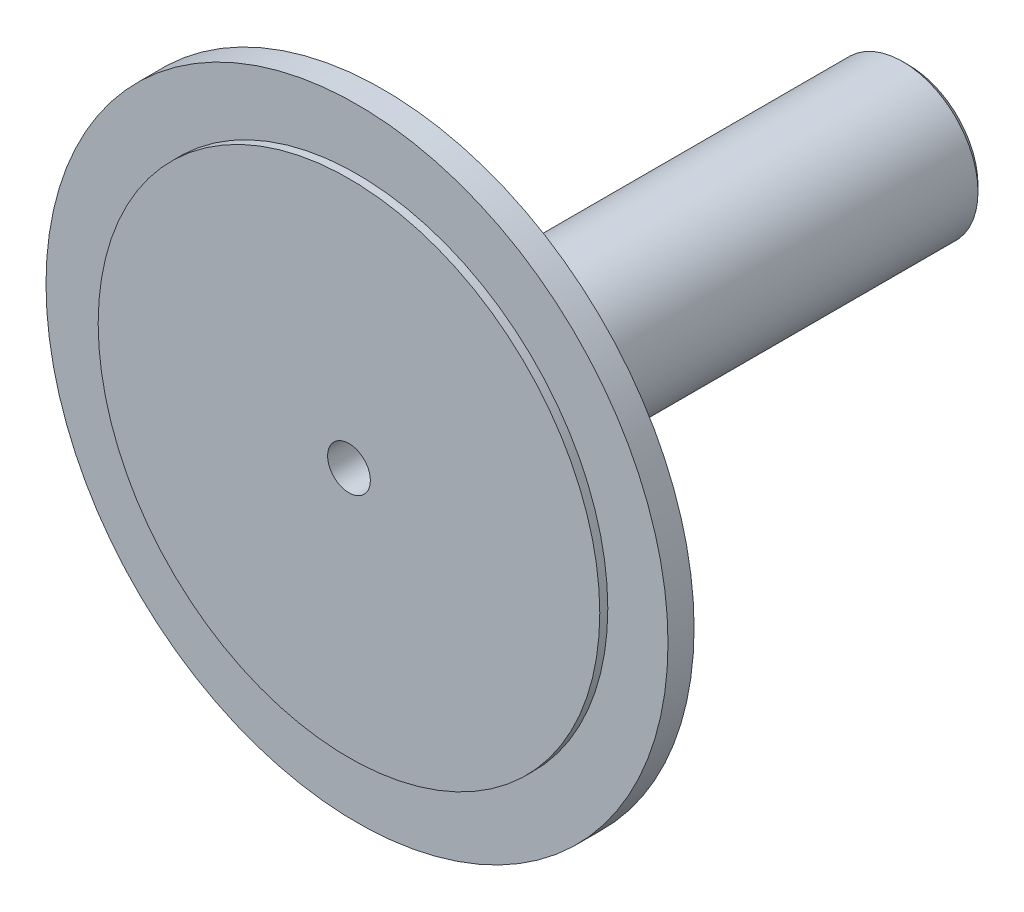
ISO-10303-21;
HEADER;
FILE_DESCRIPTION(('STEP AP214'),'2;1');
FILE_NAME('part.step','',(''),(''),'','','');
FILE_SCHEMA(('AUTOMOTIVE_DESIGN { 1 0 10303 214 1 1 1 1 }'));
ENDSEC;
DATA;
#1=APPLICATION_CONTEXT('core data for automotive mechanical design processes');
#2=APPLICATION_PROTOCOL_DEFINITION('international standard','automotive_design',2000,#1);
#3=PRODUCT_CONTEXT('',#1,'mechanical');
#4=PRODUCT('Part','Part','',(#3));
#5=PRODUCT_RELATED_PRODUCT_CATEGORY('part','',(#4));
#6=PRODUCT_DEFINITION_FORMATION('','',#4);
#7=PRODUCT_DEFINITION_CONTEXT('part definition',#1,'design');
#8=PRODUCT_DEFINITION('design','',#6,#7);
#9=PRODUCT_DEFINITION_SHAPE('','',#8);
#10=(LENGTH_UNIT() NAMED_UNIT(*) SI_UNIT(.MILLI.,.METRE.));
#11=(NAMED_UNIT(*) PLANE_ANGLE_UNIT() SI_UNIT($,.RADIAN.));
#12=(NAMED_UNIT(*) SI_UNIT($,.STERADIAN.) SOLID_ANGLE_UNIT());
#13=UNCERTAINTY_MEASURE_WITH_UNIT(LENGTH_MEASURE(1.E-05),#10,'distance_accuracy_value','');
#14=(GEOMETRIC_REPRESENTATION_CONTEXT(3) GLOBAL_UNCERTAINTY_ASSIGNED_CONTEXT((#13)) GLOBAL_UNIT_ASSIGNED_CONTEXT((#10,
#11,#12)) REPRESENTATION_CONTEXT('',''));
#15=CARTESIAN_POINT('',(0.,0.,0.));
#16=DIRECTION('',(0.,0.,1.));
#17=DIRECTION('',(1.,0.,0.));
#18=AXIS2_PLACEMENT_3D('',#15,#16,#17);
#19=CARTESIAN_POINT('',(0.,0.,6.35));
#20=DIRECTION('',(0.,0.,-1.));
#21=DIRECTION('',(-1.,0.,0.));
#22=AXIS2_PLACEMENT_3D('',#19,#20,#21);
#23=CYLINDRICAL_SURFACE('',#22,39.37);
#24=CARTESIAN_POINT('',(0.,0.,3.04800000000001));
#25=DIRECTION('',(0.,0.,1.));
#26=DIRECTION('',(1.,0.,0.));
#27=AXIS2_PLACEMENT_3D('',#24,#25,#26);
#28=CIRCLE('',#27,39.37);
#29=CARTESIAN_POINT('',(39.37,0.,3.04800000000001));
#30=VERTEX_POINT('',#29);
#31=EDGE_CURVE('E42',#30,#30,#28,.T.);
#32=ORIENTED_EDGE('',*,*,#31,.T.);
#33=EDGE_LOOP('',(#32));
#34=FACE_BOUND('',#33,.T.);
#35=CARTESIAN_POINT('',(0.,0.,6.35));
#36=DIRECTION('',(0.,0.,1.));
#37=DIRECTION('',(1.,0.,0.));
#38=AXIS2_PLACEMENT_3D('',#35,#36,#37);
#39=CIRCLE('',#38,39.37);
#40=CARTESIAN_POINT('',(39.37,0.,6.35));
#41=VERTEX_POINT('',#40);
#42=EDGE_CURVE('E61',#41,#41,#39,.T.);
#43=ORIENTED_EDGE('',*,*,#42,.F.);
#44=EDGE_LOOP('',(#43));
#45=FACE_BOUND('',#44,.T.);
#46=ADVANCED_FACE('F35',(#34,#45),#23,.T.);
#47=CARTESIAN_POINT('',(0.,0.,6.35));
#48=DIRECTION('',(0.,0.,1.));
#49=DIRECTION('',(1.,0.,0.));
#50=AXIS2_PLACEMENT_3D('',#47,#48,#49);
#51=PLANE('',#50);
#52=CARTESIAN_POINT('',(0.,0.,6.35));
#53=DIRECTION('',(0.,0.,1.));
#54=DIRECTION('',(1.,0.,0.));
#55=AXIS2_PLACEMENT_3D('',#52,#53,#54);
#56=CIRCLE('',#55,31.75);
#57=CARTESIAN_POINT('',(31.75,0.,6.35));
#58=VERTEX_POINT('',#57);
#59=EDGE_CURVE('E65',#58,#58,#56,.T.);
#60=ORIENTED_EDGE('',*,*,#59,.F.);
#61=EDGE_LOOP('',(#60));
#62=FACE_BOUND('',#61,.T.);
#63=ORIENTED_EDGE('',*,*,#42,.T.);
#64=EDGE_LOOP('',(#63));
#65=FACE_BOUND('',#64,.T.);
#66=ADVANCED_FACE('F100',(#62,#65),#51,.T.);
#67=CARTESIAN_POINT('',(0.,0.,0.));
#68=DIRECTION('',(0.,0.,1.));
#69=DIRECTION('',(1.,0.,0.));
#70=AXIS2_PLACEMENT_3D('',#67,#68,#69);
#71=PLANE('',#70);
#72=CARTESIAN_POINT('',(0.,0.,0.));
#73=DIRECTION('',(0.,0.,1.));
#74=DIRECTION('',(1.,0.,0.));
#75=AXIS2_PLACEMENT_3D('',#72,#73,#74);
#76=CIRCLE('',#75,34.0907091385301);
#77=CARTESIAN_POINT('',(34.0907091385301,0.,0.));
#78=VERTEX_POINT('',#77);
#79=EDGE_CURVE('E10',#78,#78,#76,.F.);
#80=ORIENTED_EDGE('',*,*,#79,.T.);
#81=EDGE_LOOP('',(#80));
#82=FACE_BOUND('',#81,.T.);
#83=CARTESIAN_POINT('',(0.,0.,0.));
#84=DIRECTION('',(0.,0.,1.));
#85=DIRECTION('',(1.,0.,0.));
#86=AXIS2_PLACEMENT_3D('',#83,#84,#85);
#87=CIRCLE('',#86,10.287);
#88=CARTESIAN_POINT('',(10.287,0.,0.));
#89=VERTEX_POINT('',#88);
#90=EDGE_CURVE('E46',#89,#89,#87,.T.);
#91=ORIENTED_EDGE('',*,*,#90,.T.);
#92=EDGE_LOOP('',(#91));
#93=FACE_BOUND('',#92,.T.);
#94=ADVANCED_FACE('F96',(#82,#93),#71,.F.);
#95=CARTESIAN_POINT('',(0.,0.,7.366));
#96=DIRECTION('',(0.,0.,-1.));
#97=DIRECTION('',(-1.,0.,0.));
#98=AXIS2_PLACEMENT_3D('',#95,#96,#97);
#99=CYLINDRICAL_SURFACE('',#98,31.75);
#100=CARTESIAN_POINT('',(0.,0.,7.366));
#101=DIRECTION('',(0.,0.,1.));
#102=DIRECTION('',(1.,0.,0.));
#103=AXIS2_PLACEMENT_3D('',#100,#101,#102);
#104=CIRCLE('',#103,31.75);
#105=CARTESIAN_POINT('',(31.75,0.,7.366));
#106=VERTEX_POINT('',#105);
#107=EDGE_CURVE('E64',#106,#106,#104,.T.);
#108=ORIENTED_EDGE('',*,*,#107,.F.);
#109=EDGE_LOOP('',(#108));
#110=FACE_BOUND('',#109,.T.);
#111=ORIENTED_EDGE('',*,*,#59,.T.);
#112=EDGE_LOOP('',(#111));
#113=FACE_BOUND('',#112,.T.);
#114=ADVANCED_FACE('F90',(#110,#113),#99,.T.);
#115=CARTESIAN_POINT('',(0.,0.,7.366));
#116=DIRECTION('',(0.,0.,1.));
#117=DIRECTION('',(1.,0.,0.));
#118=AXIS2_PLACEMENT_3D('',#115,#116,#117);
#119=PLANE('',#118);
#120=CARTESIAN_POINT('',(0.,0.,7.366));
#121=DIRECTION('',(0.,0.,1.));
#122=DIRECTION('',(1.,0.,0.));
#123=AXIS2_PLACEMENT_3D('',#120,#121,#122);
#124=CIRCLE('',#123,2.7051);
#125=CARTESIAN_POINT('',(2.7051,0.,7.366));
#126=VERTEX_POINT('',#125);
#127=EDGE_CURVE('E68',#126,#126,#124,.T.);
#128=ORIENTED_EDGE('',*,*,#127,.F.);
#129=EDGE_LOOP('',(#128));
#130=FACE_BOUND('',#129,.T.);
#131=ORIENTED_EDGE('',*,*,#107,.T.);
#132=EDGE_LOOP('',(#131));
#133=FACE_BOUND('',#132,.T.);
#134=ADVANCED_FACE('F86',(#130,#133),#119,.T.);
#135=CARTESIAN_POINT('',(0.,0.,-63.5));
#136=DIRECTION('',(0.,0.,1.));
#137=DIRECTION('',(1.,0.,0.));
#138=AXIS2_PLACEMENT_3D('',#135,#136,#137);
#139=CYLINDRICAL_SURFACE('',#138,9.525);
#140=CARTESIAN_POINT('',(0.,0.,-62.738));
#141=DIRECTION('',(0.,0.,-1.));
#142=DIRECTION('',(-1.,0.,0.));
#143=AXIS2_PLACEMENT_3D('',#140,#141,#142);
#144=CIRCLE('',#143,9.525);
#145=CARTESIAN_POINT('',(9.525,0.,-62.738));
#146=VERTEX_POINT('',#145);
#147=EDGE_CURVE('E50',#146,#146,#144,.F.);
#148=CARTESIAN_POINT('',(0.,0.,-0.762000000000013));
#149=DIRECTION('',(0.,0.,1.));
#150=DIRECTION('',(1.,0.,0.));
#151=AXIS2_PLACEMENT_3D('',#148,#149,#150);
#152=CIRCLE('',#151,9.525);
#153=CARTESIAN_POINT('',(9.525,0.,-0.762000000000013));
#154=VERTEX_POINT('',#153);
#155=EDGE_CURVE('E55',#154,#154,#152,.F.);
#156=CARTESIAN_POINT('',(9.525,0.,-62.738));
#157=CARTESIAN_POINT('',(9.525,0.,-62.0924166666667));
#158=CARTESIAN_POINT('',(9.525,0.,-61.4468333333333));
#159=CARTESIAN_POINT('',(9.525,0.,-60.1556666666666));
#160=CARTESIAN_POINT('',(9.525,0.,-59.5100833333333));
#161=CARTESIAN_POINT('',(9.525,0.,-58.2189166666667));
#162=CARTESIAN_POINT('',(9.525,0.,-57.5733333333333));
#163=CARTESIAN_POINT('',(9.525,0.,-56.2821666666667));
#164=CARTESIAN_POINT('',(9.525,0.,-55.6365833333333));
#165=CARTESIAN_POINT('',(9.525,0.,-54.3454166666667));
#166=CARTESIAN_POINT('',(9.525,0.,-53.6998333333333));
#167=CARTESIAN_POINT('',(9.525,0.,-52.4086666666667));
#168=CARTESIAN_POINT('',(9.525,0.,-51.7630833333333));
#169=CARTESIAN_POINT('',(9.525,0.,-50.4719166666667));
#170=CARTESIAN_POINT('',(9.525,0.,-49.8263333333333));
#171=CARTESIAN_POINT('',(9.525,0.,-48.5351666666667));
#172=CARTESIAN_POINT('',(9.525,0.,-47.8895833333333));
#173=CARTESIAN_POINT('',(9.525,0.,-46.5984166666667));
#174=CARTESIAN_POINT('',(9.525,0.,-45.9528333333333));
#175=CARTESIAN_POINT('',(9.525,0.,-44.6616666666667));
#176=CARTESIAN_POINT('',(9.525,0.,-44.0160833333333));
#177=CARTESIAN_POINT('',(9.525,0.,-42.7249166666667));
#178=CARTESIAN_POINT('',(9.525,0.,-42.0793333333333));
#179=CARTESIAN_POINT('',(9.525,0.,-40.7881666666667));
#180=CARTESIAN_POINT('',(9.525,0.,-40.1425833333333));
#181=CARTESIAN_POINT('',(9.525,0.,-38.8514166666667));
#182=CARTESIAN_POINT('',(9.525,0.,-38.2058333333333));
#183=CARTESIAN_POINT('',(9.525,0.,-36.9146666666667));
#184=CARTESIAN_POINT('',(9.525,0.,-36.2690833333333));
#185=CARTESIAN_POINT('',(9.525,0.,-34.9779166666667));
#186=CARTESIAN_POINT('',(9.525,0.,-34.3323333333333));
#187=CARTESIAN_POINT('',(9.525,0.,-33.0411666666667));
#188=CARTESIAN_POINT('',(9.525,0.,-32.3955833333333));
#189=CARTESIAN_POINT('',(9.525,0.,-31.1044166666667));
#190=CARTESIAN_POINT('',(9.525,0.,-30.4588333333333));
#191=CARTESIAN_POINT('',(9.525,0.,-29.1676666666667));
#192=CARTESIAN_POINT('',(9.525,0.,-28.5220833333333));
#193=CARTESIAN_POINT('',(9.525,0.,-27.2309166666667));
#194=CARTESIAN_POINT('',(9.525,0.,-26.5853333333333));
#195=CARTESIAN_POINT('',(9.525,0.,-25.2941666666667));
#196=CARTESIAN_POINT('',(9.525,0.,-24.6485833333333));
#197=CARTESIAN_POINT('',(9.525,0.,-23.3574166666667));
#198=CARTESIAN_POINT('',(9.525,0.,-22.7118333333333));
#199=CARTESIAN_POINT('',(9.525,0.,-21.4206666666667));
#200=CARTESIAN_POINT('',(9.525,0.,-20.7750833333333));
#201=CARTESIAN_POINT('',(9.525,0.,-19.4839166666667));
#202=CARTESIAN_POINT('',(9.525,0.,-18.8383333333333));
#203=CARTESIAN_POINT('',(9.525,0.,-17.5471666666667));
#204=CARTESIAN_POINT('',(9.525,0.,-16.9015833333333));
#205=CARTESIAN_POINT('',(9.525,0.,-15.6104166666667));
#206=CARTESIAN_POINT('',(9.525,0.,-14.9648333333333));
#207=CARTESIAN_POINT('',(9.525,0.,-13.6736666666667));
#208=CARTESIAN_POINT('',(9.525,0.,-13.0280833333333));
#209=CARTESIAN_POINT('',(9.525,0.,-11.7369166666667));
#210=CARTESIAN_POINT('',(9.525,0.,-11.0913333333333));
#211=CARTESIAN_POINT('',(9.525,0.,-9.80016666666668));
#212=CARTESIAN_POINT('',(9.525,0.,-9.15458333333334));
#213=CARTESIAN_POINT('',(9.525,0.,-7.86341666666668));
#214=CARTESIAN_POINT('',(9.525,0.,-7.21783333333334));
#215=CARTESIAN_POINT('',(9.525,0.,-5.92666666666668));
#216=CARTESIAN_POINT('',(9.525,0.,-5.28108333333334));
#217=CARTESIAN_POINT('',(9.525,0.,-3.98991666666668));
#218=CARTESIAN_POINT('',(9.525,0.,-3.34433333333335));
#219=CARTESIAN_POINT('',(9.525,0.,-2.05316666666668));
#220=CARTESIAN_POINT('',(9.525,0.,-1.40758333333335));
#221=CARTESIAN_POINT('',(9.525,0.,-0.762000000000013));
#222=B_SPLINE_CURVE_WITH_KNOTS('',3,(#156,#157,#158,#159,#160,#161,#162,#163,#164,#165,#166,
#167,#168,#169,#170,#171,#172,#173,#174,#175,#176,#177,#178,#179,#180,#181,#182,#183,#184,#185,
#186,#187,#188,#189,#190,#191,#192,#193,#194,#195,#196,#197,#198,#199,#200,#201,#202,#203,#204,
#205,#206,#207,#208,#209,#210,#211,#212,#213,#214,#215,#216,#217,#218,#219,#220,#221),
.UNSPECIFIED.,.F.,.F.,(4,2,2,2,2,2,2,2,2,2,2,2,2,2,2,2,2,2,2,2,2,2,2,2,2,2,2,2,2,2,2,2,4),(0.,
1.93675000000001,3.8735,5.81025,7.747,9.68375000000001,11.6205,13.55725,15.494,17.43075,19.3675,
21.30425,23.241,25.17775,27.1145,29.05125,30.988,32.92475,34.8615,36.79825,38.735,40.67175,
42.6085,44.54525,46.482,48.41875,50.3555,52.29225,54.229,56.16575,58.1025,60.03925,61.976),.UNSPECIFIED.);
#223=EDGE_CURVE('BSEAM89',#146,#154,#222,.T.);
#224=ORIENTED_EDGE('',*,*,#147,.T.);
#225=ORIENTED_EDGE('',*,*,#155,.T.);
#226=ORIENTED_EDGE('',*,*,#223,.T.);
#227=ORIENTED_EDGE('',*,*,#223,.F.);
#228=EDGE_LOOP('',(#224,#226,#225,#227));
#229=FACE_BOUND('',#228,.T.);
#230=ADVANCED_FACE('F89',(#229),#139,.T.);
#231=CARTESIAN_POINT('',(0.,0.,-63.5));
#232=DIRECTION('',(0.,0.,-1.));
#233=DIRECTION('',(-1.,0.,0.));
#234=AXIS2_PLACEMENT_3D('',#231,#232,#233);
#235=PLANE('',#234);
#236=CARTESIAN_POINT('',(0.,0.,-63.5));
#237=DIRECTION('',(0.,0.,-1.));
#238=DIRECTION('',(-1.,0.,0.));
#239=AXIS2_PLACEMENT_3D('',#236,#237,#238);
#240=CIRCLE('',#239,8.763);
#241=CARTESIAN_POINT('',(8.76300000000001,0.,-63.5));
#242=VERTEX_POINT('',#241);
#243=EDGE_CURVE('E58',#242,#242,#240,.T.);
#244=ORIENTED_EDGE('',*,*,#243,.T.);
#245=EDGE_LOOP('',(#244));
#246=FACE_BOUND('',#245,.T.);
#247=ADVANCED_FACE('F114',(#246),#235,.T.);
#248=CARTESIAN_POINT('',(0.,0.,-63.5));
#249=DIRECTION('',(0.,0.,1.));
#250=DIRECTION('',(1.,0.,0.));
#251=AXIS2_PLACEMENT_3D('',#248,#249,#250);
#252=CONICAL_SURFACE('',#251,8.763,0.785398163397439);
#253=CARTESIAN_POINT('',(9.52500000000001,0.,-62.738));
#254=CARTESIAN_POINT('',(9.51706250000001,0.,-62.7459375));
#255=CARTESIAN_POINT('',(9.50912500000001,0.,-62.753875));
#256=CARTESIAN_POINT('',(9.49325000000001,0.,-62.76975));
#257=CARTESIAN_POINT('',(9.48531250000001,0.,-62.7776875));
#258=CARTESIAN_POINT('',(9.46943750000001,0.,-62.7935625));
#259=CARTESIAN_POINT('',(9.46150000000001,0.,-62.8015));
#260=CARTESIAN_POINT('',(9.44562500000001,0.,-62.817375));
#261=CARTESIAN_POINT('',(9.43768750000001,0.,-62.8253125));
#262=CARTESIAN_POINT('',(9.42181250000001,0.,-62.8411875));
#263=CARTESIAN_POINT('',(9.41387500000001,0.,-62.849125));
#264=CARTESIAN_POINT('',(9.39800000000001,0.,-62.865));
#265=CARTESIAN_POINT('',(9.39006250000001,0.,-62.8729375));
#266=CARTESIAN_POINT('',(9.37418750000001,0.,-62.8888125));
#267=CARTESIAN_POINT('',(9.36625000000001,0.,-62.89675));
#268=CARTESIAN_POINT('',(9.35037500000001,0.,-62.912625));
#269=CARTESIAN_POINT('',(9.34243750000001,0.,-62.9205625));
#270=CARTESIAN_POINT('',(9.32656250000001,0.,-62.9364375));
#271=CARTESIAN_POINT('',(9.31862500000001,0.,-62.944375));
#272=CARTESIAN_POINT('',(9.30275000000001,0.,-62.96025));
#273=CARTESIAN_POINT('',(9.29481250000001,0.,-62.9681875));
#274=CARTESIAN_POINT('',(9.27893750000001,0.,-62.9840625));
#275=CARTESIAN_POINT('',(9.27100000000001,0.,-62.992));
#276=CARTESIAN_POINT('',(9.25512500000001,0.,-63.007875));
#277=CARTESIAN_POINT('',(9.24718750000001,0.,-63.0158125));
#278=CARTESIAN_POINT('',(9.23131250000001,0.,-63.0316875));
#279=CARTESIAN_POINT('',(9.22337500000001,0.,-63.039625));
#280=CARTESIAN_POINT('',(9.20750000000001,0.,-63.0555));
#281=CARTESIAN_POINT('',(9.19956250000001,0.,-63.0634375));
#282=CARTESIAN_POINT('',(9.18368750000001,0.,-63.0793125));
#283=CARTESIAN_POINT('',(9.17575000000001,0.,-63.08725));
#284=CARTESIAN_POINT('',(9.15987500000001,0.,-63.103125));
#285=CARTESIAN_POINT('',(9.15193750000001,0.,-63.1110625));
#286=CARTESIAN_POINT('',(9.13606250000001,0.,-63.1269375));
#287=CARTESIAN_POINT('',(9.12812500000001,0.,-63.134875));
#288=CARTESIAN_POINT('',(9.11225000000001,0.,-63.15075));
#289=CARTESIAN_POINT('',(9.10431250000001,0.,-63.1586875));
#290=CARTESIAN_POINT('',(9.08843750000001,0.,-63.1745625));
#291=CARTESIAN_POINT('',(9.08050000000001,0.,-63.1825));
#292=CARTESIAN_POINT('',(9.06462500000001,0.,-63.198375));
#293=CARTESIAN_POINT('',(9.05668750000001,0.,-63.2063125));
#294=CARTESIAN_POINT('',(9.04081250000001,0.,-63.2221875));
#295=CARTESIAN_POINT('',(9.03287500000001,0.,-63.230125));
#296=CARTESIAN_POINT('',(9.01700000000001,0.,-63.246));
#297=CARTESIAN_POINT('',(9.00906250000001,0.,-63.2539375));
#298=CARTESIAN_POINT('',(8.99318750000001,0.,-63.2698125));
#299=CARTESIAN_POINT('',(8.98525000000001,0.,-63.27775));
#300=CARTESIAN_POINT('',(8.96937500000001,0.,-63.293625));
#301=CARTESIAN_POINT('',(8.96143750000001,0.,-63.3015625));
#302=CARTESIAN_POINT('',(8.94556250000001,0.,-63.3174375));
#303=CARTESIAN_POINT('',(8.93762500000001,0.,-63.325375));
#304=CARTESIAN_POINT('',(8.92175000000001,0.,-63.34125));
#305=CARTESIAN_POINT('',(8.91381250000001,0.,-63.3491875));
#306=CARTESIAN_POINT('',(8.89793750000001,0.,-63.3650625));
#307=CARTESIAN_POINT('',(8.89000000000001,0.,-63.373));
#308=CARTESIAN_POINT('',(8.87412500000001,0.,-63.388875));
#309=CARTESIAN_POINT('',(8.86618750000001,0.,-63.3968125));
#310=CARTESIAN_POINT('',(8.85031250000001,0.,-63.4126875));
#311=CARTESIAN_POINT('',(8.84237500000001,0.,-63.420625));
#312=CARTESIAN_POINT('',(8.82650000000001,0.,-63.4365));
#313=CARTESIAN_POINT('',(8.81856250000001,0.,-63.4444375));
#314=CARTESIAN_POINT('',(8.80268750000001,0.,-63.4603125));
#315=CARTESIAN_POINT('',(8.79475000000001,0.,-63.46825));
#316=CARTESIAN_POINT('',(8.77887500000001,0.,-63.484125));
#317=CARTESIAN_POINT('',(8.77093750000001,0.,-63.4920625));
#318=CARTESIAN_POINT('',(8.76300000000001,0.,-63.5));
#319=B_SPLINE_CURVE_WITH_KNOTS('',3,(#253,#254,#255,#256,#257,#258,#259,#260,#261,#262,#263,
#264,#265,#266,#267,#268,#269,#270,#271,#272,#273,#274,#275,#276,#277,#278,#279,#280,#281,#282,
#283,#284,#285,#286,#287,#288,#289,#290,#291,#292,#293,#294,#295,#296,#297,#298,#299,#300,#301,
#302,#303,#304,#305,#306,#307,#308,#309,#310,#311,#312,#313,#314,#315,#316,#317,#318),
.UNSPECIFIED.,.F.,.F.,(4,2,2,2,2,2,2,2,2,2,2,2,2,2,2,2,2,2,2,2,2,2,2,2,2,2,2,2,2,2,2,2,4),(0.,
0.0336759604540172,0.0673519209080247,0.101027881362033,0.134703841816041,0.168379802270048,
0.202055762724065,0.235731723178074,0.269407683632082,0.303083644086089,0.336759604540096,
0.370435564994115,0.404111525448122,0.43778748590213,0.471463446356137,0.505139406810146,
0.538815367264153,0.57249132771817,0.606167288172178,0.639843248626187,0.673519209080194,
0.707195169534201,0.740871129988219,0.774547090442227,0.808223050896235,0.841899011350242,
0.875574971804251,0.909250932258268,0.942926892712275,0.976602853166283,1.01027881362029,
1.0439547740743,1.07763073452832),.UNSPECIFIED.);
#320=EDGE_CURVE('BSEAM112',#146,#242,#319,.T.);
#321=ORIENTED_EDGE('',*,*,#147,.F.);
#322=ORIENTED_EDGE('',*,*,#243,.F.);
#323=ORIENTED_EDGE('',*,*,#320,.T.);
#324=ORIENTED_EDGE('',*,*,#320,.F.);
#325=EDGE_LOOP('',(#321,#323,#322,#324));
#326=FACE_BOUND('',#325,.T.);
#327=ADVANCED_FACE('F112',(#326),#252,.T.);
#328=CARTESIAN_POINT('',(0.,0.,-0.762000000000013));
#329=DIRECTION('',(0.,0.,1.));
#330=DIRECTION('',(1.,0.,0.));
#331=AXIS2_PLACEMENT_3D('',#328,#329,#330);
#332=CONICAL_SURFACE('',#331,9.525,0.78539816339744);
#333=CARTESIAN_POINT('',(10.287,0.,0.));
#334=CARTESIAN_POINT('',(10.2790625,0.,-0.00793750000000067));
#335=CARTESIAN_POINT('',(10.271125,0.,-0.0158750000000007));
#336=CARTESIAN_POINT('',(10.25525,0.,-0.0317500000000006));
#337=CARTESIAN_POINT('',(10.2473125,0.,-0.0396875000000006));
#338=CARTESIAN_POINT('',(10.2314375,0.,-0.0555625000000009));
#339=CARTESIAN_POINT('',(10.2235,0.,-0.0635000000000011));
#340=CARTESIAN_POINT('',(10.207625,0.,-0.0793750000000015));
#341=CARTESIAN_POINT('',(10.1996875,0.,-0.0873125000000015));
#342=CARTESIAN_POINT('',(10.1838125,0.,-0.103187500000002));
#343=CARTESIAN_POINT('',(10.175875,0.,-0.111125000000002));
#344=CARTESIAN_POINT('',(10.16,0.,-0.127000000000002));
#345=CARTESIAN_POINT('',(10.1520625,0.,-0.134937500000002));
#346=CARTESIAN_POINT('',(10.1361875,0.,-0.150812500000002));
#347=CARTESIAN_POINT('',(10.12825,0.,-0.158750000000003));
#348=CARTESIAN_POINT('',(10.112375,0.,-0.174625000000003));
#349=CARTESIAN_POINT('',(10.1044375,0.,-0.182562500000003));
#350=CARTESIAN_POINT('',(10.0885625,0.,-0.198437500000003));
#351=CARTESIAN_POINT('',(10.080625,0.,-0.206375000000003));
#352=CARTESIAN_POINT('',(10.06475,0.,-0.222250000000004));
#353=CARTESIAN_POINT('',(10.0568125,0.,-0.230187500000004));
#354=CARTESIAN_POINT('',(10.0409375,0.,-0.246062500000004));
#355=CARTESIAN_POINT('',(10.033,0.,-0.254000000000004));
#356=CARTESIAN_POINT('',(10.017125,0.,-0.269875000000005));
#357=CARTESIAN_POINT('',(10.0091875,0.,-0.277812500000005));
#358=CARTESIAN_POINT('',(9.9933125,0.,-0.293687500000005));
#359=CARTESIAN_POINT('',(9.985375,0.,-0.301625000000005));
#360=CARTESIAN_POINT('',(9.9695,0.,-0.317500000000005));
#361=CARTESIAN_POINT('',(9.9615625,0.,-0.325437500000005));
#362=CARTESIAN_POINT('',(9.9456875,0.,-0.341312500000006));
#363=CARTESIAN_POINT('',(9.93775,0.,-0.349250000000006));
#364=CARTESIAN_POINT('',(9.921875,0.,-0.365125000000006));
#365=CARTESIAN_POINT('',(9.9139375,0.,-0.373062500000006));
#366=CARTESIAN_POINT('',(9.8980625,0.,-0.388937500000006));
#367=CARTESIAN_POINT('',(9.890125,0.,-0.396875000000007));
#368=CARTESIAN_POINT('',(9.87425,0.,-0.412750000000007));
#369=CARTESIAN_POINT('',(9.8663125,0.,-0.420687500000007));
#370=CARTESIAN_POINT('',(9.8504375,0.,-0.436562500000007));
#371=CARTESIAN_POINT('',(9.8425,0.,-0.444500000000008));
#372=CARTESIAN_POINT('',(9.826625,0.,-0.460375000000008));
#373=CARTESIAN_POINT('',(9.8186875,0.,-0.468312500000008));
#374=CARTESIAN_POINT('',(9.8028125,0.,-0.484187500000008));
#375=CARTESIAN_POINT('',(9.794875,0.,-0.492125000000008));
#376=CARTESIAN_POINT('',(9.779,0.,-0.508000000000009));
#377=CARTESIAN_POINT('',(9.7710625,0.,-0.515937500000009));
#378=CARTESIAN_POINT('',(9.7551875,0.,-0.531812500000009));
#379=CARTESIAN_POINT('',(9.74725,0.,-0.539750000000009));
#380=CARTESIAN_POINT('',(9.731375,0.,-0.555625000000009));
#381=CARTESIAN_POINT('',(9.7234375,0.,-0.56356250000001));
#382=CARTESIAN_POINT('',(9.7075625,0.,-0.57943750000001));
#383=CARTESIAN_POINT('',(9.699625,0.,-0.58737500000001));
#384=CARTESIAN_POINT('',(9.68375,0.,-0.60325000000001));
#385=CARTESIAN_POINT('',(9.6758125,0.,-0.61118750000001));
#386=CARTESIAN_POINT('',(9.6599375,0.,-0.627062500000011));
#387=CARTESIAN_POINT('',(9.652,0.,-0.635000000000011));
#388=CARTESIAN_POINT('',(9.636125,0.,-0.650875000000011));
#389=CARTESIAN_POINT('',(9.6281875,0.,-0.658812500000011));
#390=CARTESIAN_POINT('',(9.6123125,0.,-0.674687500000011));
#391=CARTESIAN_POINT('',(9.604375,0.,-0.682625000000011));
#392=CARTESIAN_POINT('',(9.5885,0.,-0.698500000000012));
#393=CARTESIAN_POINT('',(9.5805625,0.,-0.706437500000012));
#394=CARTESIAN_POINT('',(9.5646875,0.,-0.722312500000012));
#395=CARTESIAN_POINT('',(9.55675,0.,-0.730250000000012));
#396=CARTESIAN_POINT('',(9.540875,0.,-0.746125000000012));
#397=CARTESIAN_POINT('',(9.5329375,0.,-0.754062500000012));
#398=CARTESIAN_POINT('',(9.525,0.,-0.762000000000013));
#399=B_SPLINE_CURVE_WITH_KNOTS('',3,(#333,#334,#335,#336,#337,#338,#339,#340,#341,#342,#343,
#344,#345,#346,#347,#348,#349,#350,#351,#352,#353,#354,#355,#356,#357,#358,#359,#360,#361,#362,
#363,#364,#365,#366,#367,#368,#369,#370,#371,#372,#373,#374,#375,#376,#377,#378,#379,#380,#381,
#382,#383,#384,#385,#386,#387,#388,#389,#390,#391,#392,#393,#394,#395,#396,#397,#398),
.UNSPECIFIED.,.F.,.F.,(4,2,2,2,2,2,2,2,2,2,2,2,2,2,2,2,2,2,2,2,2,2,2,2,2,2,2,2,2,2,2,2,4),(0.,
0.0336759604540093,0.0673519209080198,0.101027881362029,0.134703841816038,0.168379802270048,
0.202055762724058,0.235731723178067,0.269407683632077,0.303083644086087,0.336759604540096,
0.370435564994106,0.404111525448115,0.437787485902125,0.471463446356135,0.505139406810144,
0.538815367264155,0.572491327718164,0.606167288172173,0.639843248626182,0.673519209080193,
0.707195169534202,0.740871129988211,0.774547090442222,0.808223050896231,0.84189901135024,
0.87557497180425,0.90925093225826,0.942926892712269,0.976602853166278,1.01027881362029,
1.0439547740743,1.07763073452831),.UNSPECIFIED.);
#400=EDGE_CURVE('BSEAM82',#89,#154,#399,.T.);
#401=ORIENTED_EDGE('',*,*,#90,.F.);
#402=ORIENTED_EDGE('',*,*,#155,.F.);
#403=ORIENTED_EDGE('',*,*,#400,.T.);
#404=ORIENTED_EDGE('',*,*,#400,.F.);
#405=EDGE_LOOP('',(#401,#403,#402,#404));
#406=FACE_BOUND('',#405,.T.);
#407=ADVANCED_FACE('F82',(#406),#332,.T.);
#408=CARTESIAN_POINT('',(0.,0.,7.366));
#409=DIRECTION('',(0.,0.,1.));
#410=DIRECTION('',(1.,0.,0.));
#411=AXIS2_PLACEMENT_3D('',#408,#409,#410);
#412=CYLINDRICAL_SURFACE('',#411,2.7051);
#413=CARTESIAN_POINT('',(0.,0.,-11.684));
#414=DIRECTION('',(0.,0.,1.));
#415=DIRECTION('',(1.,0.,0.));
#416=AXIS2_PLACEMENT_3D('',#413,#414,#415);
#417=CIRCLE('',#416,2.7051);
#418=CARTESIAN_POINT('',(2.7051,0.,-11.684));
#419=VERTEX_POINT('',#418);
#420=EDGE_CURVE('E73',#419,#419,#417,.T.);
#421=ORIENTED_EDGE('',*,*,#420,.F.);
#422=EDGE_LOOP('',(#421));
#423=FACE_BOUND('',#422,.T.);
#424=ORIENTED_EDGE('',*,*,#127,.T.);
#425=EDGE_LOOP('',(#424));
#426=FACE_BOUND('',#425,.T.);
#427=ADVANCED_FACE('F79',(#423,#426),#412,.F.);
#428=CARTESIAN_POINT('',(0.,0.,-11.684));
#429=DIRECTION('',(0.,0.,-1.));
#430=DIRECTION('',(-1.,0.,0.));
#431=AXIS2_PLACEMENT_3D('',#428,#429,#430);
#432=PLANE('',#431);
#433=ORIENTED_EDGE('',*,*,#420,.T.);
#434=EDGE_LOOP('',(#433));
#435=FACE_BOUND('',#434,.T.);
#436=ADVANCED_FACE('F77',(#435),#432,.F.);
#437=CARTESIAN_POINT('',(0.,0.,3.04800000000001));
#438=DIRECTION('',(0.,0.,1.));
#439=DIRECTION('',(1.,0.,0.));
#440=AXIS2_PLACEMENT_3D('',#437,#438,#439);
#441=CONICAL_SURFACE('',#440,39.37,1.04719755119659);
#442=ORIENTED_EDGE('',*,*,#79,.F.);
#443=EDGE_LOOP('',(#442));
#444=FACE_BOUND('',#443,.T.);
#445=ORIENTED_EDGE('',*,*,#31,.F.);
#446=EDGE_LOOP('',(#445));
#447=FACE_BOUND('',#446,.T.);
#448=ADVANCED_FACE('F37',(#444,#447),#441,.T.);
#449=CLOSED_SHELL('',(#46,#66,#94,#114,#134,#230,#247,#327,#407,#427,#436,#448));
#450=MANIFOLD_SOLID_BREP('B2',#449);
#451=ADVANCED_BREP_SHAPE_REPRESENTATION('',(#18,#450),#14);
#452=SHAPE_DEFINITION_REPRESENTATION(#9,#451);
ENDSEC;
END-ISO-10303-21;
